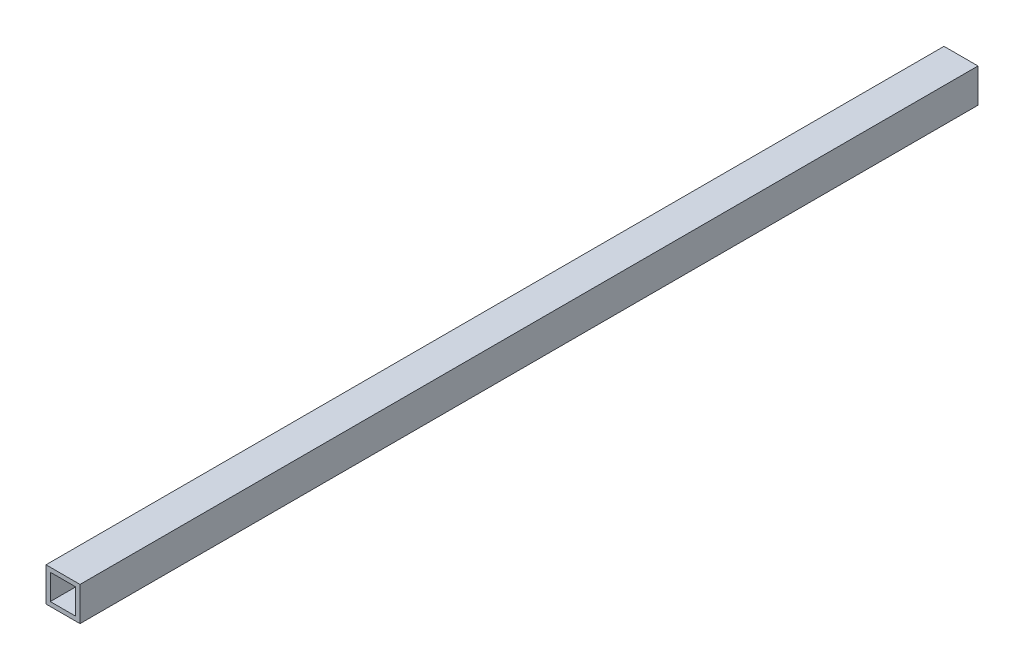
ISO-10303-21;
HEADER;
FILE_DESCRIPTION(('STEP AP214'),'2;1');
FILE_NAME('part.step','',(''),(''),'','','');
FILE_SCHEMA(('AUTOMOTIVE_DESIGN { 1 0 10303 214 1 1 1 1 }'));
ENDSEC;
DATA;
#1=APPLICATION_CONTEXT('core data for automotive mechanical design processes');
#2=APPLICATION_PROTOCOL_DEFINITION('international standard','automotive_design',2000,#1);
#3=PRODUCT_CONTEXT('',#1,'mechanical');
#4=PRODUCT('Part','Part','',(#3));
#5=PRODUCT_RELATED_PRODUCT_CATEGORY('part','',(#4));
#6=PRODUCT_DEFINITION_FORMATION('','',#4);
#7=PRODUCT_DEFINITION_CONTEXT('part definition',#1,'design');
#8=PRODUCT_DEFINITION('design','',#6,#7);
#9=PRODUCT_DEFINITION_SHAPE('','',#8);
#10=(LENGTH_UNIT() NAMED_UNIT(*) SI_UNIT(.MILLI.,.METRE.));
#11=(NAMED_UNIT(*) PLANE_ANGLE_UNIT() SI_UNIT($,.RADIAN.));
#12=(NAMED_UNIT(*) SI_UNIT($,.STERADIAN.) SOLID_ANGLE_UNIT());
#13=UNCERTAINTY_MEASURE_WITH_UNIT(LENGTH_MEASURE(1.E-05),#10,'distance_accuracy_value','');
#14=(GEOMETRIC_REPRESENTATION_CONTEXT(3) GLOBAL_UNCERTAINTY_ASSIGNED_CONTEXT((#13)) GLOBAL_UNIT_ASSIGNED_CONTEXT((#10,
#11,#12)) REPRESENTATION_CONTEXT('',''));
#15=CARTESIAN_POINT('',(0.,0.,0.));
#16=DIRECTION('',(0.,0.,1.));
#17=DIRECTION('',(1.,0.,0.));
#18=AXIS2_PLACEMENT_3D('',#15,#16,#17);
#19=CARTESIAN_POINT('',(0.,0.,160.));
#20=DIRECTION('',(0.,0.,1.));
#21=DIRECTION('',(1.,0.,0.));
#22=AXIS2_PLACEMENT_3D('',#19,#20,#21);
#23=PLANE('',#22);
#24=DIRECTION('',(0.,1.,0.));
#25=VECTOR('',#24,1.);
#26=CARTESIAN_POINT('',(6.06,6.06,160.));
#27=LINE('',#26,#25);
#28=CARTESIAN_POINT('',(6.06,-6.06,160.));
#29=VERTEX_POINT('',#28);
#30=CARTESIAN_POINT('',(6.06,6.06,160.));
#31=VERTEX_POINT('',#30);
#32=EDGE_CURVE('E153',#29,#31,#27,.T.);
#33=ORIENTED_EDGE('',*,*,#32,.T.);
#34=DIRECTION('',(-1.,0.,0.));
#35=VECTOR('',#34,1.);
#36=CARTESIAN_POINT('',(-6.06,6.06,160.));
#37=LINE('',#36,#35);
#38=CARTESIAN_POINT('',(-6.06,6.06,160.));
#39=VERTEX_POINT('',#38);
#40=EDGE_CURVE('E157',#31,#39,#37,.T.);
#41=ORIENTED_EDGE('',*,*,#40,.T.);
#42=DIRECTION('',(0.,-1.,0.));
#43=VECTOR('',#42,1.);
#44=CARTESIAN_POINT('',(-6.06,6.06,160.));
#45=LINE('',#44,#43);
#46=CARTESIAN_POINT('',(-6.06,-6.06,160.));
#47=VERTEX_POINT('',#46);
#48=EDGE_CURVE('E161',#39,#47,#45,.T.);
#49=ORIENTED_EDGE('',*,*,#48,.T.);
#50=DIRECTION('',(1.,0.,0.));
#51=VECTOR('',#50,1.);
#52=CARTESIAN_POINT('',(-6.06,-6.06,160.));
#53=LINE('',#52,#51);
#54=EDGE_CURVE('E164',#47,#29,#53,.T.);
#55=ORIENTED_EDGE('',*,*,#54,.T.);
#56=EDGE_LOOP('',(#33,#41,#49,#55));
#57=FACE_BOUND('',#56,.T.);
#58=DIRECTION('',(-1.,0.,0.));
#59=VECTOR('',#58,1.);
#60=CARTESIAN_POINT('',(-4.53,4.53,160.));
#61=LINE('',#60,#59);
#62=CARTESIAN_POINT('',(4.53,4.53,160.));
#63=VERTEX_POINT('',#62);
#64=CARTESIAN_POINT('',(-4.53,4.53,160.));
#65=VERTEX_POINT('',#64);
#66=EDGE_CURVE('E114',#63,#65,#61,.T.);
#67=ORIENTED_EDGE('',*,*,#66,.F.);
#68=DIRECTION('',(0.,1.,0.));
#69=VECTOR('',#68,1.);
#70=CARTESIAN_POINT('',(4.53,4.53,160.));
#71=LINE('',#70,#69);
#72=CARTESIAN_POINT('',(4.53,-4.53,160.));
#73=VERTEX_POINT('',#72);
#74=EDGE_CURVE('E105',#73,#63,#71,.T.);
#75=ORIENTED_EDGE('',*,*,#74,.F.);
#76=DIRECTION('',(1.,0.,0.));
#77=VECTOR('',#76,1.);
#78=CARTESIAN_POINT('',(-4.53,-4.53,160.));
#79=LINE('',#78,#77);
#80=CARTESIAN_POINT('',(-4.53,-4.53,160.));
#81=VERTEX_POINT('',#80);
#82=EDGE_CURVE('E131',#81,#73,#79,.T.);
#83=ORIENTED_EDGE('',*,*,#82,.F.);
#84=DIRECTION('',(0.,-1.,0.));
#85=VECTOR('',#84,1.);
#86=CARTESIAN_POINT('',(-4.53,4.53,160.));
#87=LINE('',#86,#85);
#88=EDGE_CURVE('E127',#65,#81,#87,.T.);
#89=ORIENTED_EDGE('',*,*,#88,.F.);
#90=EDGE_LOOP('',(#67,#75,#83,#89));
#91=FACE_BOUND('',#90,.T.);
#92=ADVANCED_FACE('F39',(#57,#91),#23,.T.);
#93=CARTESIAN_POINT('',(0.,0.,-160.));
#94=DIRECTION('',(0.,0.,1.));
#95=DIRECTION('',(1.,0.,0.));
#96=AXIS2_PLACEMENT_3D('',#93,#94,#95);
#97=PLANE('',#96);
#98=DIRECTION('',(0.,1.,0.));
#99=VECTOR('',#98,1.);
#100=CARTESIAN_POINT('',(6.06,6.06,-160.));
#101=LINE('',#100,#99);
#102=CARTESIAN_POINT('',(6.06,-6.06,-160.));
#103=VERTEX_POINT('',#102);
#104=CARTESIAN_POINT('',(6.06,6.06,-160.));
#105=VERTEX_POINT('',#104);
#106=EDGE_CURVE('E123',#103,#105,#101,.T.);
#107=ORIENTED_EDGE('',*,*,#106,.F.);
#108=DIRECTION('',(1.,0.,0.));
#109=VECTOR('',#108,1.);
#110=CARTESIAN_POINT('',(-6.06,-6.06,-160.));
#111=LINE('',#110,#109);
#112=CARTESIAN_POINT('',(-6.06,-6.06,-160.));
#113=VERTEX_POINT('',#112);
#114=EDGE_CURVE('E158',#113,#103,#111,.T.);
#115=ORIENTED_EDGE('',*,*,#114,.F.);
#116=DIRECTION('',(0.,-1.,0.));
#117=VECTOR('',#116,1.);
#118=CARTESIAN_POINT('',(-6.06,6.06,-160.));
#119=LINE('',#118,#117);
#120=CARTESIAN_POINT('',(-6.06,6.06,-160.));
#121=VERTEX_POINT('',#120);
#122=EDGE_CURVE('E174',#121,#113,#119,.T.);
#123=ORIENTED_EDGE('',*,*,#122,.F.);
#124=DIRECTION('',(-1.,0.,0.));
#125=VECTOR('',#124,1.);
#126=CARTESIAN_POINT('',(-6.06,6.06,-160.));
#127=LINE('',#126,#125);
#128=EDGE_CURVE('E171',#105,#121,#127,.T.);
#129=ORIENTED_EDGE('',*,*,#128,.F.);
#130=EDGE_LOOP('',(#107,#115,#123,#129));
#131=FACE_BOUND('',#130,.T.);
#132=DIRECTION('',(0.,1.,0.));
#133=VECTOR('',#132,1.);
#134=CARTESIAN_POINT('',(4.53,4.53,-160.));
#135=LINE('',#134,#133);
#136=CARTESIAN_POINT('',(4.53,-4.53,-160.));
#137=VERTEX_POINT('',#136);
#138=CARTESIAN_POINT('',(4.53,4.53,-160.));
#139=VERTEX_POINT('',#138);
#140=EDGE_CURVE('E63',#137,#139,#135,.T.);
#141=ORIENTED_EDGE('',*,*,#140,.T.);
#142=DIRECTION('',(-1.,0.,0.));
#143=VECTOR('',#142,1.);
#144=CARTESIAN_POINT('',(-4.53,4.53,-160.));
#145=LINE('',#144,#143);
#146=CARTESIAN_POINT('',(-4.53,4.53,-160.));
#147=VERTEX_POINT('',#146);
#148=EDGE_CURVE('E121',#139,#147,#145,.T.);
#149=ORIENTED_EDGE('',*,*,#148,.T.);
#150=DIRECTION('',(0.,-1.,0.));
#151=VECTOR('',#150,1.);
#152=CARTESIAN_POINT('',(-4.53,4.53,-160.));
#153=LINE('',#152,#151);
#154=CARTESIAN_POINT('',(-4.53,-4.53,-160.));
#155=VERTEX_POINT('',#154);
#156=EDGE_CURVE('E140',#147,#155,#153,.T.);
#157=ORIENTED_EDGE('',*,*,#156,.T.);
#158=DIRECTION('',(1.,0.,0.));
#159=VECTOR('',#158,1.);
#160=CARTESIAN_POINT('',(-4.53,-4.53,-160.));
#161=LINE('',#160,#159);
#162=EDGE_CURVE('E115',#155,#137,#161,.T.);
#163=ORIENTED_EDGE('',*,*,#162,.T.);
#164=EDGE_LOOP('',(#141,#149,#157,#163));
#165=FACE_BOUND('',#164,.T.);
#166=ADVANCED_FACE('F197',(#131,#165),#97,.F.);
#167=CARTESIAN_POINT('',(6.06,6.06,160.));
#168=DIRECTION('',(-1.,0.,0.));
#169=DIRECTION('',(0.,0.,1.));
#170=AXIS2_PLACEMENT_3D('',#167,#168,#169);
#171=PLANE('',#170);
#172=ORIENTED_EDGE('',*,*,#106,.T.);
#173=DIRECTION('',(0.,0.,-1.));
#174=VECTOR('',#173,1.);
#175=CARTESIAN_POINT('',(6.06,6.06,160.));
#176=LINE('',#175,#174);
#177=EDGE_CURVE('E11',#31,#105,#176,.T.);
#178=ORIENTED_EDGE('',*,*,#177,.F.);
#179=ORIENTED_EDGE('',*,*,#32,.F.);
#180=DIRECTION('',(0.,0.,-1.));
#181=VECTOR('',#180,1.);
#182=CARTESIAN_POINT('',(6.06,-6.06,160.));
#183=LINE('',#182,#181);
#184=EDGE_CURVE('E167',#29,#103,#183,.T.);
#185=ORIENTED_EDGE('',*,*,#184,.T.);
#186=EDGE_LOOP('',(#172,#178,#179,#185));
#187=FACE_BOUND('',#186,.T.);
#188=ADVANCED_FACE('F41',(#187),#171,.F.);
#189=CARTESIAN_POINT('',(-6.06,6.06,160.));
#190=DIRECTION('',(0.,-1.,0.));
#191=DIRECTION('',(0.,0.,-1.));
#192=AXIS2_PLACEMENT_3D('',#189,#190,#191);
#193=PLANE('',#192);
#194=ORIENTED_EDGE('',*,*,#128,.T.);
#195=DIRECTION('',(0.,0.,-1.));
#196=VECTOR('',#195,1.);
#197=CARTESIAN_POINT('',(-6.06,6.06,160.));
#198=LINE('',#197,#196);
#199=EDGE_CURVE('E48',#39,#121,#198,.T.);
#200=ORIENTED_EDGE('',*,*,#199,.F.);
#201=ORIENTED_EDGE('',*,*,#40,.F.);
#202=ORIENTED_EDGE('',*,*,#177,.T.);
#203=EDGE_LOOP('',(#194,#200,#201,#202));
#204=FACE_BOUND('',#203,.T.);
#205=ADVANCED_FACE('F207',(#204),#193,.F.);
#206=CARTESIAN_POINT('',(-6.06,6.06,160.));
#207=DIRECTION('',(1.,0.,0.));
#208=DIRECTION('',(0.,0.,-1.));
#209=AXIS2_PLACEMENT_3D('',#206,#207,#208);
#210=PLANE('',#209);
#211=ORIENTED_EDGE('',*,*,#122,.T.);
#212=DIRECTION('',(0.,0.,-1.));
#213=VECTOR('',#212,1.);
#214=CARTESIAN_POINT('',(-6.06,-6.06,160.));
#215=LINE('',#214,#213);
#216=EDGE_CURVE('E182',#47,#113,#215,.T.);
#217=ORIENTED_EDGE('',*,*,#216,.F.);
#218=ORIENTED_EDGE('',*,*,#48,.F.);
#219=ORIENTED_EDGE('',*,*,#199,.T.);
#220=EDGE_LOOP('',(#211,#217,#218,#219));
#221=FACE_BOUND('',#220,.T.);
#222=ADVANCED_FACE('F191',(#221),#210,.F.);
#223=CARTESIAN_POINT('',(-6.06,-6.06,160.));
#224=DIRECTION('',(0.,1.,0.));
#225=DIRECTION('',(0.,0.,1.));
#226=AXIS2_PLACEMENT_3D('',#223,#224,#225);
#227=PLANE('',#226);
#228=ORIENTED_EDGE('',*,*,#114,.T.);
#229=ORIENTED_EDGE('',*,*,#184,.F.);
#230=ORIENTED_EDGE('',*,*,#54,.F.);
#231=ORIENTED_EDGE('',*,*,#216,.T.);
#232=EDGE_LOOP('',(#228,#229,#230,#231));
#233=FACE_BOUND('',#232,.T.);
#234=ADVANCED_FACE('F201',(#233),#227,.F.);
#235=CARTESIAN_POINT('',(4.53,4.53,160.));
#236=DIRECTION('',(-1.,0.,0.));
#237=DIRECTION('',(0.,0.,1.));
#238=AXIS2_PLACEMENT_3D('',#235,#236,#237);
#239=PLANE('',#238);
#240=ORIENTED_EDGE('',*,*,#140,.F.);
#241=DIRECTION('',(0.,0.,-1.));
#242=VECTOR('',#241,1.);
#243=CARTESIAN_POINT('',(4.53,-4.53,160.));
#244=LINE('',#243,#242);
#245=EDGE_CURVE('E109',#73,#137,#244,.T.);
#246=ORIENTED_EDGE('',*,*,#245,.F.);
#247=ORIENTED_EDGE('',*,*,#74,.T.);
#248=DIRECTION('',(0.,0.,-1.));
#249=VECTOR('',#248,1.);
#250=CARTESIAN_POINT('',(4.53,4.53,160.));
#251=LINE('',#250,#249);
#252=EDGE_CURVE('E108',#63,#139,#251,.T.);
#253=ORIENTED_EDGE('',*,*,#252,.T.);
#254=EDGE_LOOP('',(#240,#246,#247,#253));
#255=FACE_BOUND('',#254,.T.);
#256=ADVANCED_FACE('F107',(#255),#239,.T.);
#257=CARTESIAN_POINT('',(-4.53,4.53,160.));
#258=DIRECTION('',(0.,-1.,0.));
#259=DIRECTION('',(0.,0.,-1.));
#260=AXIS2_PLACEMENT_3D('',#257,#258,#259);
#261=PLANE('',#260);
#262=ORIENTED_EDGE('',*,*,#148,.F.);
#263=ORIENTED_EDGE('',*,*,#252,.F.);
#264=ORIENTED_EDGE('',*,*,#66,.T.);
#265=DIRECTION('',(0.,0.,-1.));
#266=VECTOR('',#265,1.);
#267=CARTESIAN_POINT('',(-4.53,4.53,160.));
#268=LINE('',#267,#266);
#269=EDGE_CURVE('E124',#65,#147,#268,.T.);
#270=ORIENTED_EDGE('',*,*,#269,.T.);
#271=EDGE_LOOP('',(#262,#263,#264,#270));
#272=FACE_BOUND('',#271,.T.);
#273=ADVANCED_FACE('F118',(#272),#261,.T.);
#274=CARTESIAN_POINT('',(-4.53,4.53,160.));
#275=DIRECTION('',(1.,0.,0.));
#276=DIRECTION('',(0.,0.,-1.));
#277=AXIS2_PLACEMENT_3D('',#274,#275,#276);
#278=PLANE('',#277);
#279=ORIENTED_EDGE('',*,*,#156,.F.);
#280=ORIENTED_EDGE('',*,*,#269,.F.);
#281=ORIENTED_EDGE('',*,*,#88,.T.);
#282=DIRECTION('',(0.,0.,-1.));
#283=VECTOR('',#282,1.);
#284=CARTESIAN_POINT('',(-4.53,-4.53,160.));
#285=LINE('',#284,#283);
#286=EDGE_CURVE('E55',#81,#155,#285,.T.);
#287=ORIENTED_EDGE('',*,*,#286,.T.);
#288=EDGE_LOOP('',(#279,#280,#281,#287));
#289=FACE_BOUND('',#288,.T.);
#290=ADVANCED_FACE('F230',(#289),#278,.T.);
#291=CARTESIAN_POINT('',(-4.53,-4.53,160.));
#292=DIRECTION('',(0.,1.,0.));
#293=DIRECTION('',(0.,0.,1.));
#294=AXIS2_PLACEMENT_3D('',#291,#292,#293);
#295=PLANE('',#294);
#296=ORIENTED_EDGE('',*,*,#162,.F.);
#297=ORIENTED_EDGE('',*,*,#286,.F.);
#298=ORIENTED_EDGE('',*,*,#82,.T.);
#299=ORIENTED_EDGE('',*,*,#245,.T.);
#300=EDGE_LOOP('',(#296,#297,#298,#299));
#301=FACE_BOUND('',#300,.T.);
#302=ADVANCED_FACE('F234',(#301),#295,.T.);
#303=CLOSED_SHELL('',(#92,#166,#188,#205,#222,#234,#256,#273,#290,#302));
#304=MANIFOLD_SOLID_BREP('B2',#303);
#305=ADVANCED_BREP_SHAPE_REPRESENTATION('',(#18,#304),#14);
#306=SHAPE_DEFINITION_REPRESENTATION(#9,#305);
ENDSEC;
END-ISO-10303-21;
